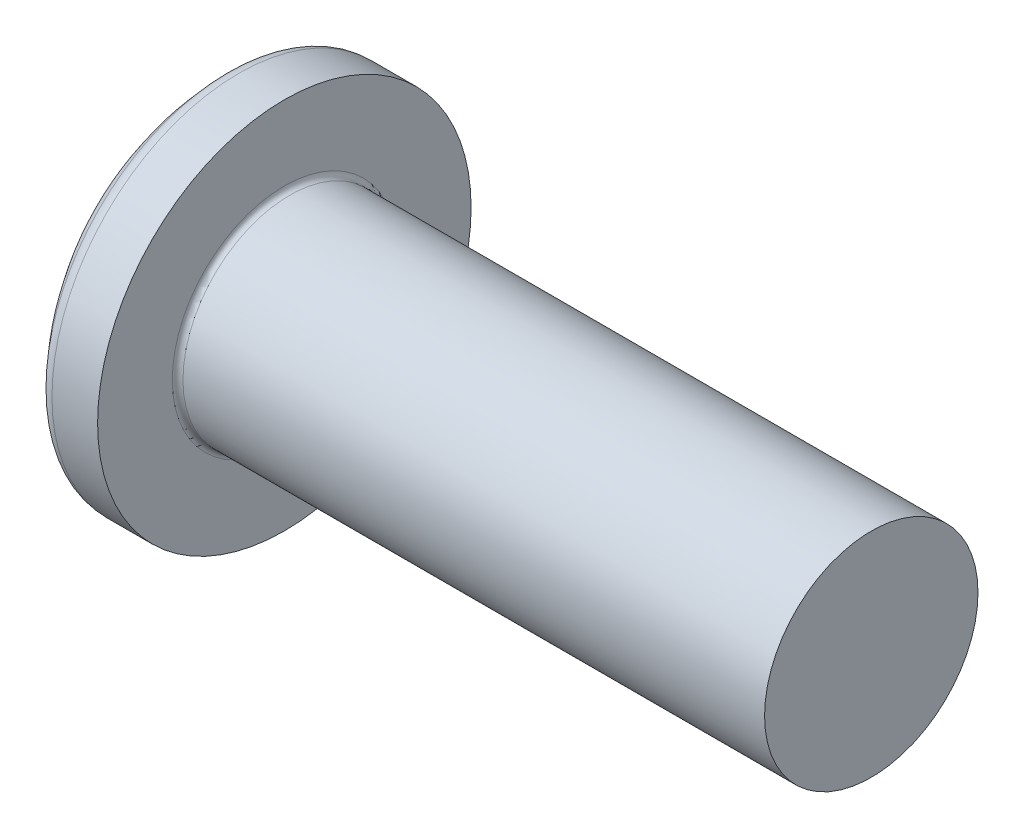
ISO-10303-21;
HEADER;
FILE_DESCRIPTION(('STEP AP214'),'2;1');
FILE_NAME('part.step','',(''),(''),'','','');
FILE_SCHEMA(('AUTOMOTIVE_DESIGN { 1 0 10303 214 1 1 1 1 }'));
ENDSEC;
DATA;
#1=APPLICATION_CONTEXT('core data for automotive mechanical design processes');
#2=APPLICATION_PROTOCOL_DEFINITION('international standard','automotive_design',2000,#1);
#3=PRODUCT_CONTEXT('',#1,'mechanical');
#4=PRODUCT('Part','Part','',(#3));
#5=PRODUCT_RELATED_PRODUCT_CATEGORY('part','',(#4));
#6=PRODUCT_DEFINITION_FORMATION('','',#4);
#7=PRODUCT_DEFINITION_CONTEXT('part definition',#1,'design');
#8=PRODUCT_DEFINITION('design','',#6,#7);
#9=PRODUCT_DEFINITION_SHAPE('','',#8);
#10=(LENGTH_UNIT() NAMED_UNIT(*) SI_UNIT(.MILLI.,.METRE.));
#11=(NAMED_UNIT(*) PLANE_ANGLE_UNIT() SI_UNIT($,.RADIAN.));
#12=(NAMED_UNIT(*) SI_UNIT($,.STERADIAN.) SOLID_ANGLE_UNIT());
#13=UNCERTAINTY_MEASURE_WITH_UNIT(LENGTH_MEASURE(1.E-05),#10,'distance_accuracy_value','');
#14=(GEOMETRIC_REPRESENTATION_CONTEXT(3) GLOBAL_UNCERTAINTY_ASSIGNED_CONTEXT((#13)) GLOBAL_UNIT_ASSIGNED_CONTEXT((#10,
#11,#12)) REPRESENTATION_CONTEXT('',''));
#15=CARTESIAN_POINT('',(0.,0.,0.));
#16=DIRECTION('',(0.,0.,1.));
#17=DIRECTION('',(1.,0.,0.));
#18=AXIS2_PLACEMENT_3D('',#15,#16,#17);
#19=CARTESIAN_POINT('',(5.,0.,0.));
#20=DIRECTION('',(-1.,0.,0.));
#21=DIRECTION('',(0.,1.,0.));
#22=AXIS2_PLACEMENT_3D('',#19,#20,#21);
#23=SPHERICAL_SURFACE('',#22,5.);
#24=CARTESIAN_POINT('',(1.34732504372706,0.,0.));
#25=DIRECTION('',(-1.,0.,0.));
#26=DIRECTION('',(0.,0.,1.));
#27=AXIS2_PLACEMENT_3D('',#24,#25,#26);
#28=CIRCLE('',#27,3.41437632135307);
#29=CARTESIAN_POINT('',(1.34732504372706,0.,3.41437632135307));
#30=VERTEX_POINT('',#29);
#31=EDGE_CURVE('E242',#30,#30,#28,.T.);
#32=ORIENTED_EDGE('',*,*,#31,.T.);
#33=EDGE_LOOP('',(#32));
#34=FACE_BOUND('',#33,.T.);
#35=CARTESIAN_POINT('',(0.04579512008964,0.,0.));
#36=DIRECTION('',(1.,0.,0.));
#37=DIRECTION('',(0.,0.,-1.));
#38=AXIS2_PLACEMENT_3D('',#35,#36,#37);
#39=CIRCLE('',#38,0.675169614150692);
#40=CARTESIAN_POINT('',(0.0457951200896408,-0.369999999999998,-0.564760133040919));
#41=VERTEX_POINT('',#40);
#42=CARTESIAN_POINT('',(0.04579512008964,-0.564760133040918,-0.37));
#43=VERTEX_POINT('',#42);
#44=EDGE_CURVE('E378',#41,#43,#39,.F.);
#45=ORIENTED_EDGE('',*,*,#44,.F.);
#46=CARTESIAN_POINT('',(5.,-0.370000000000001,0.));
#47=DIRECTION('',(0.,1.,0.));
#48=DIRECTION('',(0.,0.,1.));
#49=AXIS2_PLACEMENT_3D('',#46,#47,#48);
#50=CIRCLE('',#49,4.98629120689917);
#51=CARTESIAN_POINT('',(0.187869734228638,-0.369999999999995,-1.30633162146802));
#52=VERTEX_POINT('',#51);
#53=EDGE_CURVE('E304',#52,#41,#50,.T.);
#54=ORIENTED_EDGE('',*,*,#53,.F.);
#55=CARTESIAN_POINT('',(4.56358262530798,0.,0.875317983305918));
#56=DIRECTION('',(0.446197753347436,0.,-0.894934391398443));
#57=DIRECTION('',(-0.894934391398443,0.,-0.446197753347436));
#58=AXIS2_PLACEMENT_3D('',#55,#56,#57);
#59=CIRCLE('',#58,4.90340272700175);
#60=CARTESIAN_POINT('',(0.187869734228638,0.370000000000005,-1.30633162146802));
#61=VERTEX_POINT('',#60);
#62=EDGE_CURVE('E276',#52,#61,#59,.T.);
#63=ORIENTED_EDGE('',*,*,#62,.T.);
#64=CARTESIAN_POINT('',(5.,0.37,0.));
#65=DIRECTION('',(0.,-1.,0.));
#66=DIRECTION('',(0.,0.,-1.));
#67=AXIS2_PLACEMENT_3D('',#64,#65,#66);
#68=CIRCLE('',#67,4.98629120689917);
#69=CARTESIAN_POINT('',(0.0457951200896421,0.370000000000002,-0.564760133040916));
#70=VERTEX_POINT('',#69);
#71=EDGE_CURVE('E331',#70,#61,#68,.T.);
#72=ORIENTED_EDGE('',*,*,#71,.F.);
#73=CARTESIAN_POINT('',(0.04579512008964,0.564760133040913,-0.37));
#74=VERTEX_POINT('',#73);
#75=EDGE_CURVE('E397',#74,#70,#39,.F.);
#76=ORIENTED_EDGE('',*,*,#75,.F.);
#77=CARTESIAN_POINT('',(5.,0.,-0.37));
#78=DIRECTION('',(0.,0.,1.));
#79=DIRECTION('',(1.,0.,0.));
#80=AXIS2_PLACEMENT_3D('',#77,#78,#79);
#81=CIRCLE('',#80,4.98629120689917);
#82=CARTESIAN_POINT('',(0.18786973422864,1.30633162146802,-0.37));
#83=VERTEX_POINT('',#82);
#84=EDGE_CURVE('E270',#83,#74,#81,.T.);
#85=ORIENTED_EDGE('',*,*,#84,.F.);
#86=CARTESIAN_POINT('',(4.56358262530798,-0.87531798330592,0.));
#87=DIRECTION('',(0.446197753347436,0.894934391398443,0.));
#88=DIRECTION('',(-0.894934391398442,0.446197753347436,0.));
#89=AXIS2_PLACEMENT_3D('',#86,#87,#88);
#90=CIRCLE('',#89,4.90340272700175);
#91=CARTESIAN_POINT('',(0.187869734228639,1.30633162146802,0.37));
#92=VERTEX_POINT('',#91);
#93=EDGE_CURVE('E273',#83,#92,#90,.T.);
#94=ORIENTED_EDGE('',*,*,#93,.T.);
#95=CARTESIAN_POINT('',(5.,0.,0.370000000000001));
#96=DIRECTION('',(0.,0.,-1.));
#97=DIRECTION('',(-1.,0.,0.));
#98=AXIS2_PLACEMENT_3D('',#95,#96,#97);
#99=CIRCLE('',#98,4.98629120689917);
#100=CARTESIAN_POINT('',(0.04579512008964,0.564760133040908,0.37));
#101=VERTEX_POINT('',#100);
#102=EDGE_CURVE('E266',#101,#92,#99,.T.);
#103=ORIENTED_EDGE('',*,*,#102,.F.);
#104=CARTESIAN_POINT('',(0.0457951200896426,0.369999999999998,0.564760133040918));
#105=VERTEX_POINT('',#104);
#106=EDGE_CURVE('E396',#105,#101,#39,.F.);
#107=ORIENTED_EDGE('',*,*,#106,.F.);
#108=CARTESIAN_POINT('',(0.18786973422864,0.369999999999995,1.30633162146802));
#109=VERTEX_POINT('',#108);
#110=EDGE_CURVE('E286',#109,#105,#68,.T.);
#111=ORIENTED_EDGE('',*,*,#110,.F.);
#112=CARTESIAN_POINT('',(4.56358262530798,0.,-0.87531798330592));
#113=DIRECTION('',(0.446197753347436,0.,0.894934391398443));
#114=DIRECTION('',(0.894934391398442,0.,-0.446197753347436));
#115=AXIS2_PLACEMENT_3D('',#112,#113,#114);
#116=CIRCLE('',#115,4.90340272700175);
#117=CARTESIAN_POINT('',(0.187869734228638,-0.370000000000004,1.30633162146802));
#118=VERTEX_POINT('',#117);
#119=EDGE_CURVE('E53',#109,#118,#116,.T.);
#120=ORIENTED_EDGE('',*,*,#119,.T.);
#121=CARTESIAN_POINT('',(0.0457951200896404,-0.370000000000002,0.564760133040916));
#122=VERTEX_POINT('',#121);
#123=EDGE_CURVE('E283',#122,#118,#50,.T.);
#124=ORIENTED_EDGE('',*,*,#123,.F.);
#125=CARTESIAN_POINT('',(0.04579512008964,-0.564760133040914,0.37));
#126=VERTEX_POINT('',#125);
#127=EDGE_CURVE('E436',#126,#122,#39,.F.);
#128=ORIENTED_EDGE('',*,*,#127,.F.);
#129=CARTESIAN_POINT('',(0.187869734228638,-1.30633162146802,0.37));
#130=VERTEX_POINT('',#129);
#131=EDGE_CURVE('E267',#130,#126,#99,.T.);
#132=ORIENTED_EDGE('',*,*,#131,.F.);
#133=CARTESIAN_POINT('',(4.56358262530798,0.875317983305918,0.));
#134=DIRECTION('',(0.446197753347436,-0.894934391398443,0.));
#135=DIRECTION('',(0.894934391398443,0.446197753347436,0.));
#136=AXIS2_PLACEMENT_3D('',#133,#134,#135);
#137=CIRCLE('',#136,4.90340272700175);
#138=CARTESIAN_POINT('',(0.187869734228638,-1.30633162146802,-0.37));
#139=VERTEX_POINT('',#138);
#140=EDGE_CURVE('E263',#130,#139,#137,.T.);
#141=ORIENTED_EDGE('',*,*,#140,.T.);
#142=EDGE_CURVE('E68',#43,#139,#81,.T.);
#143=ORIENTED_EDGE('',*,*,#142,.F.);
#144=EDGE_LOOP('',(#45,#54,#63,#72,#76,#85,#94,#103,#107,#111,#120,#124,#128,#132,#141,#143));
#145=FACE_BOUND('',#144,.T.);
#146=ADVANCED_FACE('F39',(#34,#145),#23,.T.);
#147=CARTESIAN_POINT('',(1.75,0.527482331818931,-0.37));
#148=DIRECTION('',(0.,0.,1.));
#149=DIRECTION('',(1.,0.,0.));
#150=AXIS2_PLACEMENT_3D('',#147,#148,#149);
#151=PLANE('',#150);
#152=ORIENTED_EDGE('',*,*,#84,.T.);
#153=CARTESIAN_POINT('',(-0.987293237053717,0.649401255967161,-0.37));
#154=CARTESIAN_POINT('',(-0.781914975317086,0.632865887002871,-0.37));
#155=CARTESIAN_POINT('',(-0.576547882393374,0.616188977635081,-0.37));
#156=CARTESIAN_POINT('',(-0.165841599226328,0.582441031964227,-0.37));
#157=CARTESIAN_POINT('',(0.0394975903090439,0.56536998705488,-0.37));
#158=CARTESIAN_POINT('',(0.450133475422571,0.530723441326535,-0.37));
#159=CARTESIAN_POINT('',(0.655430171010572,0.513147940624557,-0.37));
#160=CARTESIAN_POINT('',(1.06596140177933,0.477314957985794,-0.37));
#161=CARTESIAN_POINT('',(1.2711959378071,0.459057485806066,-0.37));
#162=CARTESIAN_POINT('',(1.61065292365626,0.428051938688769,-0.37));
#163=CARTESIAN_POINT('',(1.74490059995642,0.415580824990931,-0.37));
#164=CARTESIAN_POINT('',(2.01334321762763,0.390092023404979,-0.37));
#165=CARTESIAN_POINT('',(2.14753815934577,0.377074339177353,-0.37));
#166=CARTESIAN_POINT('',(2.41586354151957,0.350315629452843,-0.37));
#167=CARTESIAN_POINT('',(2.5499939784531,0.33657456817765,-0.37));
#168=CARTESIAN_POINT('',(2.81814173295471,0.308004077741875,-0.37));
#169=CARTESIAN_POINT('',(2.95215904765134,0.293174621747065,-0.37));
#170=CARTESIAN_POINT('',(3.0860955068368,0.277618485071816,-0.37));
#171=B_SPLINE_CURVE_WITH_KNOTS('',3,(#153,#154,#155,#156,#157,#158,#159,#160,#161,#162,#163,
#164,#165,#166,#167,#168,#169,#170),.UNSPECIFIED.,.F.,.F.,(4,2,2,2,2,2,2,2,4),(0.,
0.618128793984691,1.23627109812525,1.85441325887562,2.4725465791681,2.87702276218609,
3.28149623678161,3.68598973550942,4.09049321032311),.UNSPECIFIED.);
#172=CARTESIAN_POINT('',(1.75,0.415013252800437,-0.370000000000001));
#173=VERTEX_POINT('',#172);
#174=EDGE_CURVE('E420',#74,#173,#171,.T.);
#175=ORIENTED_EDGE('',*,*,#174,.T.);
#176=DIRECTION('',(0.,1.,0.));
#177=VECTOR('',#176,1.);
#178=CARTESIAN_POINT('',(1.75,-0.527482331818931,-0.37));
#179=LINE('',#178,#177);
#180=CARTESIAN_POINT('',(1.75,0.527482331818931,-0.37));
#181=VERTEX_POINT('',#180);
#182=EDGE_CURVE('E360',#173,#181,#179,.T.);
#183=ORIENTED_EDGE('',*,*,#182,.T.);
#184=DIRECTION('',(0.894934391398442,-0.446197753347436,0.));
#185=VECTOR('',#184,1.);
#186=CARTESIAN_POINT('',(0.,1.4,-0.37));
#187=LINE('',#186,#185);
#188=EDGE_CURVE('E243',#83,#181,#187,.T.);
#189=ORIENTED_EDGE('',*,*,#188,.F.);
#190=EDGE_LOOP('',(#152,#175,#183,#189));
#191=FACE_BOUND('',#190,.T.);
#192=ADVANCED_FACE('F198',(#191),#151,.T.);
#193=CARTESIAN_POINT('',(1.75,-0.527482331818931,-0.37));
#194=VERTEX_POINT('',#193);
#195=CARTESIAN_POINT('',(1.75,-0.415013252800437,-0.370000000000001));
#196=VERTEX_POINT('',#195);
#197=EDGE_CURVE('E251',#194,#196,#179,.T.);
#198=ORIENTED_EDGE('',*,*,#197,.T.);
#199=CARTESIAN_POINT('',(-0.987293237053717,-0.649401255967161,-0.37));
#200=CARTESIAN_POINT('',(-0.781914975317086,-0.632865887002871,-0.37));
#201=CARTESIAN_POINT('',(-0.576547882393374,-0.616188977635081,-0.37));
#202=CARTESIAN_POINT('',(-0.165841599226328,-0.582441031964227,-0.37));
#203=CARTESIAN_POINT('',(0.0394975903090439,-0.56536998705488,-0.37));
#204=CARTESIAN_POINT('',(0.450133475422571,-0.530723441326535,-0.37));
#205=CARTESIAN_POINT('',(0.655430171010572,-0.513147940624557,-0.37));
#206=CARTESIAN_POINT('',(1.06596140177933,-0.477314957985794,-0.37));
#207=CARTESIAN_POINT('',(1.2711959378071,-0.459057485806066,-0.37));
#208=CARTESIAN_POINT('',(1.61065292365626,-0.428051938688769,-0.37));
#209=CARTESIAN_POINT('',(1.74490059995642,-0.415580824990931,-0.37));
#210=CARTESIAN_POINT('',(2.01334321762763,-0.39009202340498,-0.37));
#211=CARTESIAN_POINT('',(2.14753815934577,-0.377074339177353,-0.37));
#212=CARTESIAN_POINT('',(2.41586354151957,-0.350315629452842,-0.37));
#213=CARTESIAN_POINT('',(2.5499939784531,-0.33657456817765,-0.37));
#214=CARTESIAN_POINT('',(2.81814173295471,-0.308004077741875,-0.37));
#215=CARTESIAN_POINT('',(2.95215904765134,-0.293174621747065,-0.37));
#216=CARTESIAN_POINT('',(3.0860955068368,-0.277618485071815,-0.37));
#217=B_SPLINE_CURVE_WITH_KNOTS('',3,(#199,#200,#201,#202,#203,#204,#205,#206,#207,#208,#209,
#210,#211,#212,#213,#214,#215,#216),.UNSPECIFIED.,.F.,.F.,(4,2,2,2,2,2,2,2,4),(0.,
0.618128793984691,1.23627109812525,1.85441325887562,2.4725465791681,2.87702276218609,
3.28149623678161,3.68598973550942,4.09049321032311),.UNSPECIFIED.);
#218=EDGE_CURVE('E395',#196,#43,#217,.F.);
#219=ORIENTED_EDGE('',*,*,#218,.T.);
#220=ORIENTED_EDGE('',*,*,#142,.T.);
#221=DIRECTION('',(0.894934391398443,0.446197753347436,0.));
#222=VECTOR('',#221,1.);
#223=CARTESIAN_POINT('',(0.,-1.4,-0.37));
#224=LINE('',#223,#222);
#225=EDGE_CURVE('E334',#139,#194,#224,.T.);
#226=ORIENTED_EDGE('',*,*,#225,.T.);
#227=EDGE_LOOP('',(#198,#219,#220,#226));
#228=FACE_BOUND('',#227,.T.);
#229=ADVANCED_FACE('F204',(#228),#151,.T.);
#230=CARTESIAN_POINT('',(1.75,-0.527482331818931,0.37));
#231=DIRECTION('',(0.,0.,-1.));
#232=DIRECTION('',(-1.,0.,0.));
#233=AXIS2_PLACEMENT_3D('',#230,#231,#232);
#234=PLANE('',#233);
#235=DIRECTION('',(0.,-1.,0.));
#236=VECTOR('',#235,1.);
#237=CARTESIAN_POINT('',(1.75,0.527482331818931,0.37));
#238=LINE('',#237,#236);
#239=CARTESIAN_POINT('',(1.75,0.527482331818931,0.37));
#240=VERTEX_POINT('',#239);
#241=CARTESIAN_POINT('',(1.75,0.415013252800437,0.37));
#242=VERTEX_POINT('',#241);
#243=EDGE_CURVE('E343',#240,#242,#238,.T.);
#244=ORIENTED_EDGE('',*,*,#243,.T.);
#245=CARTESIAN_POINT('',(-0.987293237069635,0.649401255968442,0.369999999999999));
#246=CARTESIAN_POINT('',(-0.781914975331302,0.632865887004023,0.369999999999999));
#247=CARTESIAN_POINT('',(-0.576547882405888,0.616188977636103,0.369999999999999));
#248=CARTESIAN_POINT('',(-0.16584159923544,0.582441031964983,0.37));
#249=CARTESIAN_POINT('',(0.0394975903016334,0.5653699870555,0.37));
#250=CARTESIAN_POINT('',(0.450133475420601,0.530723441326706,0.37));
#251=CARTESIAN_POINT('',(0.655430171012341,0.513147940624409,0.37));
#252=CARTESIAN_POINT('',(1.06596140178858,0.477314957984981,0.37));
#253=CARTESIAN_POINT('',(1.27119593782008,0.459057485804908,0.37));
#254=CARTESIAN_POINT('',(1.61065292367297,0.428051938687225,0.37));
#255=CARTESIAN_POINT('',(1.74490059997313,0.415580824989367,0.37));
#256=CARTESIAN_POINT('',(2.01334321764434,0.390092023403371,0.37));
#257=CARTESIAN_POINT('',(2.14753815936247,0.377074339175718,0.37));
#258=CARTESIAN_POINT('',(2.41586354153627,0.350315629451146,0.37));
#259=CARTESIAN_POINT('',(2.54999397846979,0.336574568175918,0.37));
#260=CARTESIAN_POINT('',(2.8181417329714,0.308004077740053,0.37));
#261=CARTESIAN_POINT('',(2.95215904766802,0.293174621745189,0.37));
#262=CARTESIAN_POINT('',(3.08609550685347,0.277618485069873,0.37));
#263=B_SPLINE_CURVE_WITH_KNOTS('',3,(#245,#246,#247,#248,#249,#250,#251,#252,#253,#254,#255,
#256,#257,#258,#259,#260,#261,#262),.UNSPECIFIED.,.F.,.F.,(4,2,2,2,2,2,2,2,4),(0.,
0.618128793989811,1.23627109813549,1.85441325889711,2.47254657920086,2.87702276221884,
3.28149623681437,3.68598973554218,4.09049321035586),.UNSPECIFIED.);
#264=EDGE_CURVE('E675',#242,#101,#263,.F.);
#265=ORIENTED_EDGE('',*,*,#264,.T.);
#266=ORIENTED_EDGE('',*,*,#102,.T.);
#267=DIRECTION('',(0.894934391398442,-0.446197753347436,0.));
#268=VECTOR('',#267,1.);
#269=CARTESIAN_POINT('',(0.,1.4,0.37));
#270=LINE('',#269,#268);
#271=EDGE_CURVE('E248',#92,#240,#270,.T.);
#272=ORIENTED_EDGE('',*,*,#271,.T.);
#273=EDGE_LOOP('',(#244,#265,#266,#272));
#274=FACE_BOUND('',#273,.T.);
#275=ADVANCED_FACE('F416',(#274),#234,.T.);
#276=ORIENTED_EDGE('',*,*,#131,.T.);
#277=CARTESIAN_POINT('',(-0.987293237069635,-0.649401255968442,0.369999999999999));
#278=CARTESIAN_POINT('',(-0.781914975331302,-0.632865887004024,0.369999999999999));
#279=CARTESIAN_POINT('',(-0.576547882405889,-0.616188977636103,0.369999999999999));
#280=CARTESIAN_POINT('',(-0.16584159923544,-0.582441031964983,0.369999999999999));
#281=CARTESIAN_POINT('',(0.039497590301633,-0.5653699870555,0.37));
#282=CARTESIAN_POINT('',(0.450133475420601,-0.530723441326706,0.37));
#283=CARTESIAN_POINT('',(0.65543017101234,-0.513147940624409,0.37));
#284=CARTESIAN_POINT('',(1.06596140178858,-0.477314957984981,0.37));
#285=CARTESIAN_POINT('',(1.27119593782008,-0.459057485804908,0.37));
#286=CARTESIAN_POINT('',(1.61065292367297,-0.428051938687225,0.37));
#287=CARTESIAN_POINT('',(1.74490059997313,-0.415580824989367,0.37));
#288=CARTESIAN_POINT('',(2.01334321764434,-0.390092023403371,0.37));
#289=CARTESIAN_POINT('',(2.14753815936247,-0.377074339175718,0.37));
#290=CARTESIAN_POINT('',(2.41586354153627,-0.350315629451146,0.37));
#291=CARTESIAN_POINT('',(2.54999397846979,-0.336574568175918,0.37));
#292=CARTESIAN_POINT('',(2.8181417329714,-0.308004077740054,0.37));
#293=CARTESIAN_POINT('',(2.95215904766802,-0.293174621745189,0.37));
#294=CARTESIAN_POINT('',(3.08609550685347,-0.277618485069873,0.37));
#295=B_SPLINE_CURVE_WITH_KNOTS('',3,(#277,#278,#279,#280,#281,#282,#283,#284,#285,#286,#287,
#288,#289,#290,#291,#292,#293,#294),.UNSPECIFIED.,.F.,.F.,(4,2,2,2,2,2,2,2,4),(0.,
0.61812879398981,1.23627109813549,1.85441325889711,2.47254657920086,2.87702276221884,
3.28149623681436,3.68598973554217,4.09049321035586),.UNSPECIFIED.);
#296=CARTESIAN_POINT('',(1.75,-0.415013252800437,0.37));
#297=VERTEX_POINT('',#296);
#298=EDGE_CURVE('E437',#126,#297,#295,.T.);
#299=ORIENTED_EDGE('',*,*,#298,.T.);
#300=CARTESIAN_POINT('',(1.75,-0.527482331818932,0.37));
#301=VERTEX_POINT('',#300);
#302=EDGE_CURVE('E345',#297,#301,#238,.T.);
#303=ORIENTED_EDGE('',*,*,#302,.T.);
#304=DIRECTION('',(0.894934391398443,0.446197753347436,0.));
#305=VECTOR('',#304,1.);
#306=CARTESIAN_POINT('',(0.,-1.4,0.369999999999999));
#307=LINE('',#306,#305);
#308=EDGE_CURVE('E336',#130,#301,#307,.T.);
#309=ORIENTED_EDGE('',*,*,#308,.F.);
#310=EDGE_LOOP('',(#276,#299,#303,#309));
#311=FACE_BOUND('',#310,.T.);
#312=ADVANCED_FACE('F523',(#311),#234,.T.);
#313=CARTESIAN_POINT('',(0.,1.4,0.37));
#314=DIRECTION('',(0.446197753347436,0.894934391398443,0.));
#315=DIRECTION('',(-0.894934391398442,0.446197753347436,0.));
#316=AXIS2_PLACEMENT_3D('',#313,#314,#315);
#317=PLANE('',#316);
#318=CARTESIAN_POINT('',(2.6696526882832,0.0689604923233248,0.));
#319=DIRECTION('',(0.446197753347436,0.894934391398443,0.));
#320=DIRECTION('',(-0.894934391398443,0.446197753347436,0.));
#321=AXIS2_PLACEMENT_3D('',#318,#319,#320);
#322=ELLIPSE('',#321,1.10195897609154,0.486831694838766);
#323=CARTESIAN_POINT('',(1.75,0.527482331818932,0.175779377683682));
#324=VERTEX_POINT('',#323);
#325=CARTESIAN_POINT('',(1.75,0.527482331818932,-0.175779377683682));
#326=VERTEX_POINT('',#325);
#327=EDGE_CURVE('E309',#324,#326,#322,.F.);
#328=ORIENTED_EDGE('',*,*,#327,.F.);
#329=DIRECTION('',(0.,0.,-1.));
#330=VECTOR('',#329,1.);
#331=CARTESIAN_POINT('',(1.75,0.527482331818931,0.37));
#332=LINE('',#331,#330);
#333=EDGE_CURVE('E346',#240,#324,#332,.T.);
#334=ORIENTED_EDGE('',*,*,#333,.F.);
#335=ORIENTED_EDGE('',*,*,#271,.F.);
#336=ORIENTED_EDGE('',*,*,#93,.F.);
#337=ORIENTED_EDGE('',*,*,#188,.T.);
#338=EDGE_CURVE('E348',#326,#181,#332,.T.);
#339=ORIENTED_EDGE('',*,*,#338,.F.);
#340=EDGE_LOOP('',(#328,#334,#335,#336,#337,#339));
#341=FACE_BOUND('',#340,.T.);
#342=ADVANCED_FACE('F414',(#341),#317,.F.);
#343=CARTESIAN_POINT('',(0.,-1.4,-0.37));
#344=DIRECTION('',(0.446197753347436,-0.894934391398443,0.));
#345=DIRECTION('',(0.894934391398443,0.446197753347436,0.));
#346=AXIS2_PLACEMENT_3D('',#343,#344,#345);
#347=PLANE('',#346);
#348=CARTESIAN_POINT('',(2.6696526882832,-0.0689604923233254,0.));
#349=DIRECTION('',(0.446197753347436,-0.894934391398443,0.));
#350=DIRECTION('',(-0.894934391398443,-0.446197753347436,0.));
#351=AXIS2_PLACEMENT_3D('',#348,#349,#350);
#352=ELLIPSE('',#351,1.10195897609154,0.486831694838766);
#353=CARTESIAN_POINT('',(1.75,-0.527482331818932,-0.175779377683681));
#354=VERTEX_POINT('',#353);
#355=CARTESIAN_POINT('',(1.75,-0.527482331818932,0.175779377683681));
#356=VERTEX_POINT('',#355);
#357=EDGE_CURVE('E677',#354,#356,#352,.F.);
#358=ORIENTED_EDGE('',*,*,#357,.F.);
#359=DIRECTION('',(0.,0.,1.));
#360=VECTOR('',#359,1.);
#361=CARTESIAN_POINT('',(1.75,-0.527482331818931,-0.37));
#362=LINE('',#361,#360);
#363=EDGE_CURVE('E339',#194,#354,#362,.T.);
#364=ORIENTED_EDGE('',*,*,#363,.F.);
#365=ORIENTED_EDGE('',*,*,#225,.F.);
#366=ORIENTED_EDGE('',*,*,#140,.F.);
#367=ORIENTED_EDGE('',*,*,#308,.T.);
#368=EDGE_CURVE('E342',#356,#301,#362,.T.);
#369=ORIENTED_EDGE('',*,*,#368,.F.);
#370=EDGE_LOOP('',(#358,#364,#365,#366,#367,#369));
#371=FACE_BOUND('',#370,.T.);
#372=ADVANCED_FACE('F510',(#371),#347,.F.);
#373=CARTESIAN_POINT('',(1.75,0.527482331818931,-0.37));
#374=DIRECTION('',(-1.,0.,0.));
#375=DIRECTION('',(0.,0.,1.));
#376=AXIS2_PLACEMENT_3D('',#373,#374,#375);
#377=PLANE('',#376);
#378=DIRECTION('',(0.,1.,0.));
#379=VECTOR('',#378,1.);
#380=CARTESIAN_POINT('',(1.75,-0.370000000000002,0.52748233181893));
#381=LINE('',#380,#379);
#382=CARTESIAN_POINT('',(1.75,-0.370000000000002,0.52748233181893));
#383=VERTEX_POINT('',#382);
#384=CARTESIAN_POINT('',(1.75,-0.175779377683685,0.527482331818931));
#385=VERTEX_POINT('',#384);
#386=EDGE_CURVE('E324',#383,#385,#381,.T.);
#387=ORIENTED_EDGE('',*,*,#386,.T.);
#388=CARTESIAN_POINT('',(1.75,0.,0.));
#389=DIRECTION('',(-1.,0.,0.));
#390=DIRECTION('',(0.,0.,1.));
#391=AXIS2_PLACEMENT_3D('',#388,#389,#390);
#392=CIRCLE('',#391,0.556);
#393=CARTESIAN_POINT('',(1.75,-0.370000000000001,0.415013252800436));
#394=VERTEX_POINT('',#393);
#395=EDGE_CURVE('E705',#394,#385,#392,.T.);
#396=ORIENTED_EDGE('',*,*,#395,.F.);
#397=DIRECTION('',(0.,0.,-1.));
#398=VECTOR('',#397,1.);
#399=CARTESIAN_POINT('',(1.75,-0.370000000000002,0.52748233181893));
#400=LINE('',#399,#398);
#401=EDGE_CURVE('E320',#383,#394,#400,.T.);
#402=ORIENTED_EDGE('',*,*,#401,.F.);
#403=EDGE_LOOP('',(#387,#396,#402));
#404=FACE_BOUND('',#403,.T.);
#405=ADVANCED_FACE('F503',(#404),#377,.T.);
#406=ORIENTED_EDGE('',*,*,#302,.F.);
#407=EDGE_CURVE('E710',#356,#297,#392,.T.);
#408=ORIENTED_EDGE('',*,*,#407,.F.);
#409=ORIENTED_EDGE('',*,*,#368,.T.);
#410=EDGE_LOOP('',(#406,#408,#409));
#411=FACE_BOUND('',#410,.T.);
#412=ADVANCED_FACE('F496',(#411),#377,.T.);
#413=ORIENTED_EDGE('',*,*,#363,.T.);
#414=EDGE_CURVE('E389',#196,#354,#392,.T.);
#415=ORIENTED_EDGE('',*,*,#414,.F.);
#416=ORIENTED_EDGE('',*,*,#197,.F.);
#417=EDGE_LOOP('',(#413,#415,#416));
#418=FACE_BOUND('',#417,.T.);
#419=ADVANCED_FACE('F490',(#418),#377,.T.);
#420=CARTESIAN_POINT('',(1.75,-0.369999999999998,-0.415013252800438));
#421=VERTEX_POINT('',#420);
#422=CARTESIAN_POINT('',(1.75,-0.369999999999998,-0.527482331818933));
#423=VERTEX_POINT('',#422);
#424=EDGE_CURVE('E323',#421,#423,#400,.T.);
#425=ORIENTED_EDGE('',*,*,#424,.F.);
#426=CARTESIAN_POINT('',(1.75,-0.17577937768368,-0.527482331818932));
#427=VERTEX_POINT('',#426);
#428=EDGE_CURVE('E60',#427,#421,#392,.T.);
#429=ORIENTED_EDGE('',*,*,#428,.F.);
#430=DIRECTION('',(0.,-1.,0.));
#431=VECTOR('',#430,1.);
#432=CARTESIAN_POINT('',(1.75,0.370000000000002,-0.52748233181893));
#433=LINE('',#432,#431);
#434=EDGE_CURVE('E319',#427,#423,#433,.T.);
#435=ORIENTED_EDGE('',*,*,#434,.T.);
#436=EDGE_LOOP('',(#425,#429,#435));
#437=FACE_BOUND('',#436,.T.);
#438=ADVANCED_FACE('F384',(#437),#377,.T.);
#439=CARTESIAN_POINT('',(1.75,0.370000000000002,-0.52748233181893));
#440=VERTEX_POINT('',#439);
#441=CARTESIAN_POINT('',(1.75,0.175779377683684,-0.527482331818931));
#442=VERTEX_POINT('',#441);
#443=EDGE_CURVE('E316',#440,#442,#433,.T.);
#444=ORIENTED_EDGE('',*,*,#443,.T.);
#445=CARTESIAN_POINT('',(1.75,0.370000000000001,-0.415013252800437));
#446=VERTEX_POINT('',#445);
#447=EDGE_CURVE('E388',#446,#442,#392,.T.);
#448=ORIENTED_EDGE('',*,*,#447,.F.);
#449=DIRECTION('',(0.,0.,1.));
#450=VECTOR('',#449,1.);
#451=CARTESIAN_POINT('',(1.75,0.370000000000002,-0.52748233181893));
#452=LINE('',#451,#450);
#453=EDGE_CURVE('E328',#440,#446,#452,.T.);
#454=ORIENTED_EDGE('',*,*,#453,.F.);
#455=EDGE_LOOP('',(#444,#448,#454));
#456=FACE_BOUND('',#455,.T.);
#457=ADVANCED_FACE('F478',(#456),#377,.T.);
#458=ORIENTED_EDGE('',*,*,#182,.F.);
#459=EDGE_CURVE('E694',#326,#173,#392,.T.);
#460=ORIENTED_EDGE('',*,*,#459,.F.);
#461=ORIENTED_EDGE('',*,*,#338,.T.);
#462=EDGE_LOOP('',(#458,#460,#461));
#463=FACE_BOUND('',#462,.T.);
#464=ADVANCED_FACE('F471',(#463),#377,.T.);
#465=ORIENTED_EDGE('',*,*,#333,.T.);
#466=EDGE_CURVE('E696',#242,#324,#392,.T.);
#467=ORIENTED_EDGE('',*,*,#466,.F.);
#468=ORIENTED_EDGE('',*,*,#243,.F.);
#469=EDGE_LOOP('',(#465,#467,#468));
#470=FACE_BOUND('',#469,.T.);
#471=ADVANCED_FACE('F465',(#470),#377,.T.);
#472=CARTESIAN_POINT('',(1.75,0.369999999999998,0.527482331818932));
#473=DIRECTION('',(0.,-1.,0.));
#474=DIRECTION('',(1.,0.,0.));
#475=AXIS2_PLACEMENT_3D('',#472,#473,#474);
#476=PLANE('',#475);
#477=ORIENTED_EDGE('',*,*,#110,.T.);
#478=CARTESIAN_POINT('',(-0.987293237053717,0.369999999999998,0.649401255967162));
#479=CARTESIAN_POINT('',(-0.781914975317085,0.369999999999998,0.632865887002872));
#480=CARTESIAN_POINT('',(-0.576547882393373,0.369999999999998,0.616188977635082));
#481=CARTESIAN_POINT('',(-0.165841599226327,0.369999999999998,0.582441031964228));
#482=CARTESIAN_POINT('',(0.0394975903090446,0.369999999999998,0.565369987054881));
#483=CARTESIAN_POINT('',(0.450133475422572,0.369999999999998,0.530723441326536));
#484=CARTESIAN_POINT('',(0.655430171010573,0.369999999999998,0.513147940624558));
#485=CARTESIAN_POINT('',(1.06596140177934,0.369999999999998,0.477314957985795));
#486=CARTESIAN_POINT('',(1.2711959378071,0.369999999999998,0.459057485806067));
#487=CARTESIAN_POINT('',(1.61065292365626,0.369999999999999,0.42805193868877));
#488=CARTESIAN_POINT('',(1.74490059995642,0.369999999999999,0.415580824990932));
#489=CARTESIAN_POINT('',(2.01334321762763,0.369999999999999,0.390092023404981));
#490=CARTESIAN_POINT('',(2.14753815934577,0.369999999999999,0.377074339177354));
#491=CARTESIAN_POINT('',(2.41586354151957,0.369999999999999,0.350315629452844));
#492=CARTESIAN_POINT('',(2.5499939784531,0.369999999999999,0.336574568177651));
#493=CARTESIAN_POINT('',(2.81814173295471,0.369999999999999,0.308004077741876));
#494=CARTESIAN_POINT('',(2.95215904765134,0.369999999999999,0.293174621747066));
#495=CARTESIAN_POINT('',(3.0860955068368,0.369999999999999,0.277618485071817));
#496=B_SPLINE_CURVE_WITH_KNOTS('',3,(#478,#479,#480,#481,#482,#483,#484,#485,#486,#487,#488,
#489,#490,#491,#492,#493,#494,#495),.UNSPECIFIED.,.F.,.F.,(4,2,2,2,2,2,2,2,4),(0.,
0.618128793984691,1.23627109812525,1.85441325887562,2.4725465791681,2.87702276218609,
3.28149623678161,3.68598973550942,4.09049321032311),.UNSPECIFIED.);
#497=CARTESIAN_POINT('',(1.75,0.369999999999999,0.415013252800439));
#498=VERTEX_POINT('',#497);
#499=EDGE_CURVE('E674',#105,#498,#496,.T.);
#500=ORIENTED_EDGE('',*,*,#499,.T.);
#501=CARTESIAN_POINT('',(1.75,0.369999999999998,0.527482331818932));
#502=VERTEX_POINT('',#501);
#503=EDGE_CURVE('E301',#498,#502,#452,.T.);
#504=ORIENTED_EDGE('',*,*,#503,.T.);
#505=DIRECTION('',(0.894934391398442,0.,-0.446197753347436));
#506=VECTOR('',#505,1.);
#507=CARTESIAN_POINT('',(0.,0.369999999999995,1.4));
#508=LINE('',#507,#506);
#509=EDGE_CURVE('E294',#109,#502,#508,.T.);
#510=ORIENTED_EDGE('',*,*,#509,.F.);
#511=EDGE_LOOP('',(#477,#500,#504,#510));
#512=FACE_BOUND('',#511,.T.);
#513=ADVANCED_FACE('F298',(#512),#476,.T.);
#514=CARTESIAN_POINT('',(1.75,-0.369999999999998,-0.527482331818933));
#515=DIRECTION('',(0.,1.,0.));
#516=DIRECTION('',(-1.,0.,0.));
#517=AXIS2_PLACEMENT_3D('',#514,#515,#516);
#518=PLANE('',#517);
#519=ORIENTED_EDGE('',*,*,#401,.T.);
#520=CARTESIAN_POINT('',(-0.987293237069635,-0.370000000000002,0.649401255968441));
#521=CARTESIAN_POINT('',(-0.781914975331302,-0.370000000000002,0.632865887004022));
#522=CARTESIAN_POINT('',(-0.576547882405889,-0.370000000000002,0.616188977636101));
#523=CARTESIAN_POINT('',(-0.16584159923544,-0.370000000000002,0.582441031964982));
#524=CARTESIAN_POINT('',(0.0394975903016332,-0.370000000000002,0.565369987055499));
#525=CARTESIAN_POINT('',(0.450133475420601,-0.370000000000002,0.530723441326705));
#526=CARTESIAN_POINT('',(0.65543017101234,-0.370000000000002,0.513147940624408));
#527=CARTESIAN_POINT('',(1.06596140178858,-0.370000000000001,0.47731495798498));
#528=CARTESIAN_POINT('',(1.27119593782008,-0.370000000000001,0.459057485804906));
#529=CARTESIAN_POINT('',(1.61065292367297,-0.370000000000001,0.428051938687223));
#530=CARTESIAN_POINT('',(1.74490059997313,-0.370000000000001,0.415580824989366));
#531=CARTESIAN_POINT('',(2.01334321764434,-0.370000000000001,0.390092023403369));
#532=CARTESIAN_POINT('',(2.14753815936247,-0.370000000000001,0.377074339175717));
#533=CARTESIAN_POINT('',(2.41586354153627,-0.370000000000001,0.350315629451145));
#534=CARTESIAN_POINT('',(2.54999397846979,-0.370000000000001,0.336574568175917));
#535=CARTESIAN_POINT('',(2.8181417329714,-0.370000000000001,0.308004077740052));
#536=CARTESIAN_POINT('',(2.95215904766802,-0.370000000000001,0.293174621745188));
#537=CARTESIAN_POINT('',(3.08609550685347,-0.370000000000001,0.277618485069872));
#538=B_SPLINE_CURVE_WITH_KNOTS('',3,(#520,#521,#522,#523,#524,#525,#526,#527,#528,#529,#530,
#531,#532,#533,#534,#535,#536,#537),.UNSPECIFIED.,.F.,.F.,(4,2,2,2,2,2,2,2,4),(0.,
0.618128793989811,1.23627109813549,1.85441325889711,2.47254657920086,2.87702276221884,
3.28149623681437,3.68598973554218,4.09049321035586),.UNSPECIFIED.);
#539=EDGE_CURVE('E429',#394,#122,#538,.F.);
#540=ORIENTED_EDGE('',*,*,#539,.T.);
#541=ORIENTED_EDGE('',*,*,#123,.T.);
#542=DIRECTION('',(0.894934391398442,0.,-0.446197753347436));
#543=VECTOR('',#542,1.);
#544=CARTESIAN_POINT('',(0.,-0.370000000000005,1.4));
#545=LINE('',#544,#543);
#546=EDGE_CURVE('E296',#118,#383,#545,.T.);
#547=ORIENTED_EDGE('',*,*,#546,.T.);
#548=EDGE_LOOP('',(#519,#540,#541,#547));
#549=FACE_BOUND('',#548,.T.);
#550=ADVANCED_FACE('F233',(#549),#518,.T.);
#551=CARTESIAN_POINT('',(0.,-0.370000000000005,1.4));
#552=DIRECTION('',(0.446197753347436,0.,0.894934391398443));
#553=DIRECTION('',(-0.894934391398442,0.,0.446197753347436));
#554=AXIS2_PLACEMENT_3D('',#551,#552,#553);
#555=PLANE('',#554);
#556=CARTESIAN_POINT('',(2.6696526882832,0.,0.0689604923233248));
#557=DIRECTION('',(0.446197753347436,0.,0.894934391398443));
#558=DIRECTION('',(-0.894934391398443,0.,0.446197753347436));
#559=AXIS2_PLACEMENT_3D('',#556,#557,#558);
#560=ELLIPSE('',#559,1.10195897609154,0.486831694838766);
#561=CARTESIAN_POINT('',(1.75,0.175779377683682,0.527482331818932));
#562=VERTEX_POINT('',#561);
#563=EDGE_CURVE('E427',#385,#562,#560,.F.);
#564=ORIENTED_EDGE('',*,*,#563,.F.);
#565=ORIENTED_EDGE('',*,*,#386,.F.);
#566=ORIENTED_EDGE('',*,*,#546,.F.);
#567=ORIENTED_EDGE('',*,*,#119,.F.);
#568=ORIENTED_EDGE('',*,*,#509,.T.);
#569=EDGE_CURVE('E327',#562,#502,#381,.T.);
#570=ORIENTED_EDGE('',*,*,#569,.F.);
#571=EDGE_LOOP('',(#564,#565,#566,#567,#568,#570));
#572=FACE_BOUND('',#571,.T.);
#573=ADVANCED_FACE('F292',(#572),#555,.F.);
#574=CARTESIAN_POINT('',(0.,0.370000000000005,-1.4));
#575=DIRECTION('',(0.446197753347436,0.,-0.894934391398443));
#576=DIRECTION('',(0.894934391398443,0.,0.446197753347436));
#577=AXIS2_PLACEMENT_3D('',#574,#575,#576);
#578=PLANE('',#577);
#579=CARTESIAN_POINT('',(2.6696526882832,0.,-0.0689604923233255));
#580=DIRECTION('',(0.446197753347436,0.,-0.894934391398443));
#581=DIRECTION('',(-0.894934391398443,0.,-0.446197753347436));
#582=AXIS2_PLACEMENT_3D('',#579,#580,#581);
#583=ELLIPSE('',#582,1.10195897609154,0.486831694838766);
#584=EDGE_CURVE('E382',#442,#427,#583,.F.);
#585=ORIENTED_EDGE('',*,*,#584,.F.);
#586=ORIENTED_EDGE('',*,*,#443,.F.);
#587=DIRECTION('',(0.894934391398443,0.,0.446197753347436));
#588=VECTOR('',#587,1.);
#589=CARTESIAN_POINT('',(0.,0.370000000000005,-1.4));
#590=LINE('',#589,#588);
#591=EDGE_CURVE('E306',#61,#440,#590,.T.);
#592=ORIENTED_EDGE('',*,*,#591,.F.);
#593=ORIENTED_EDGE('',*,*,#62,.F.);
#594=DIRECTION('',(0.894934391398443,0.,0.446197753347436));
#595=VECTOR('',#594,1.);
#596=CARTESIAN_POINT('',(0.,-0.369999999999995,-1.4));
#597=LINE('',#596,#595);
#598=EDGE_CURVE('E313',#52,#423,#597,.T.);
#599=ORIENTED_EDGE('',*,*,#598,.T.);
#600=ORIENTED_EDGE('',*,*,#434,.F.);
#601=EDGE_LOOP('',(#585,#586,#592,#593,#599,#600));
#602=FACE_BOUND('',#601,.T.);
#603=ADVANCED_FACE('F373',(#602),#578,.F.);
#604=ORIENTED_EDGE('',*,*,#453,.T.);
#605=CARTESIAN_POINT('',(-0.987293237069636,0.370000000000002,-0.649401255968441));
#606=CARTESIAN_POINT('',(-0.781914975331303,0.370000000000002,-0.632865887004022));
#607=CARTESIAN_POINT('',(-0.57654788240589,0.370000000000002,-0.616188977636101));
#608=CARTESIAN_POINT('',(-0.165841599235441,0.370000000000002,-0.582441031964982));
#609=CARTESIAN_POINT('',(0.0394975903016319,0.370000000000002,-0.565369987055499));
#610=CARTESIAN_POINT('',(0.450133475420599,0.370000000000002,-0.530723441326705));
#611=CARTESIAN_POINT('',(0.655430171012339,0.370000000000002,-0.513147940624408));
#612=CARTESIAN_POINT('',(1.06596140178858,0.370000000000002,-0.47731495798498));
#613=CARTESIAN_POINT('',(1.27119593782008,0.370000000000002,-0.459057485804907));
#614=CARTESIAN_POINT('',(1.61065292367296,0.370000000000001,-0.428051938687224));
#615=CARTESIAN_POINT('',(1.74490059997313,0.370000000000001,-0.415580824989366));
#616=CARTESIAN_POINT('',(2.01334321764433,0.370000000000001,-0.390092023403369));
#617=CARTESIAN_POINT('',(2.14753815936247,0.370000000000001,-0.377074339175717));
#618=CARTESIAN_POINT('',(2.41586354153627,0.370000000000001,-0.350315629451145));
#619=CARTESIAN_POINT('',(2.54999397846979,0.370000000000001,-0.336574568175917));
#620=CARTESIAN_POINT('',(2.8181417329714,0.370000000000001,-0.308004077740052));
#621=CARTESIAN_POINT('',(2.95215904766802,0.370000000000001,-0.293174621745188));
#622=CARTESIAN_POINT('',(3.08609550685347,0.370000000000001,-0.277618485069872));
#623=B_SPLINE_CURVE_WITH_KNOTS('',3,(#605,#606,#607,#608,#609,#610,#611,#612,#613,#614,#615,
#616,#617,#618,#619,#620,#621,#622),.UNSPECIFIED.,.F.,.F.,(4,2,2,2,2,2,2,2,4),(0.,
0.61812879398981,1.23627109813549,1.85441325889711,2.47254657920086,2.87702276221884,
3.28149623681436,3.68598973554218,4.09049321035586),.UNSPECIFIED.);
#624=EDGE_CURVE('E369',#446,#70,#623,.F.);
#625=ORIENTED_EDGE('',*,*,#624,.T.);
#626=ORIENTED_EDGE('',*,*,#71,.T.);
#627=ORIENTED_EDGE('',*,*,#591,.T.);
#628=EDGE_LOOP('',(#604,#625,#626,#627));
#629=FACE_BOUND('',#628,.T.);
#630=ADVANCED_FACE('F231',(#629),#476,.T.);
#631=ORIENTED_EDGE('',*,*,#53,.T.);
#632=CARTESIAN_POINT('',(-0.987293237053717,-0.369999999999997,-0.649401255967162));
#633=CARTESIAN_POINT('',(-0.781914975317086,-0.369999999999997,-0.632865887002873));
#634=CARTESIAN_POINT('',(-0.576547882393374,-0.369999999999997,-0.616188977635082));
#635=CARTESIAN_POINT('',(-0.165841599226328,-0.369999999999997,-0.582441031964228));
#636=CARTESIAN_POINT('',(0.0394975903090439,-0.369999999999998,-0.565369987054881));
#637=CARTESIAN_POINT('',(0.450133475422571,-0.369999999999998,-0.530723441326536));
#638=CARTESIAN_POINT('',(0.655430171010572,-0.369999999999998,-0.513147940624558));
#639=CARTESIAN_POINT('',(1.06596140177934,-0.369999999999998,-0.477314957985795));
#640=CARTESIAN_POINT('',(1.2711959378071,-0.369999999999998,-0.459057485806068));
#641=CARTESIAN_POINT('',(1.61065292365626,-0.369999999999998,-0.42805193868877));
#642=CARTESIAN_POINT('',(1.74490059995642,-0.369999999999998,-0.415580824990932));
#643=CARTESIAN_POINT('',(2.01334321762763,-0.369999999999999,-0.390092023404981));
#644=CARTESIAN_POINT('',(2.14753815934577,-0.369999999999999,-0.377074339177355));
#645=CARTESIAN_POINT('',(2.41586354151957,-0.369999999999999,-0.350315629452844));
#646=CARTESIAN_POINT('',(2.54999397845309,-0.369999999999999,-0.336574568177652));
#647=CARTESIAN_POINT('',(2.81814173295471,-0.369999999999999,-0.308004077741876));
#648=CARTESIAN_POINT('',(2.95215904765134,-0.369999999999999,-0.293174621747066));
#649=CARTESIAN_POINT('',(3.0860955068368,-0.369999999999999,-0.277618485071817));
#650=B_SPLINE_CURVE_WITH_KNOTS('',3,(#632,#633,#634,#635,#636,#637,#638,#639,#640,#641,#642,
#643,#644,#645,#646,#647,#648,#649),.UNSPECIFIED.,.F.,.F.,(4,2,2,2,2,2,2,2,4),(0.,
0.618128793984691,1.23627109812525,1.85441325887562,2.4725465791681,2.87702276218609,
3.28149623678161,3.68598973550942,4.09049321032311),.UNSPECIFIED.);
#651=EDGE_CURVE('E11',#41,#421,#650,.T.);
#652=ORIENTED_EDGE('',*,*,#651,.T.);
#653=ORIENTED_EDGE('',*,*,#424,.T.);
#654=ORIENTED_EDGE('',*,*,#598,.F.);
#655=EDGE_LOOP('',(#631,#652,#653,#654));
#656=FACE_BOUND('',#655,.T.);
#657=ADVANCED_FACE('F226',(#656),#518,.T.);
#658=CARTESIAN_POINT('',(-25.4,0.,0.));
#659=DIRECTION('',(-1.,0.,0.));
#660=DIRECTION('',(0.,0.,1.));
#661=AXIS2_PLACEMENT_3D('',#658,#659,#660);
#662=CYLINDRICAL_SURFACE('',#661,2.);
#663=CARTESIAN_POINT('',(2.5,0.,0.));
#664=DIRECTION('',(-1.,0.,0.));
#665=DIRECTION('',(0.,0.,1.));
#666=AXIS2_PLACEMENT_3D('',#663,#664,#665);
#667=CIRCLE('',#666,2.);
#668=CARTESIAN_POINT('',(2.5,0.,2.));
#669=VERTEX_POINT('',#668);
#670=EDGE_CURVE('E237',#669,#669,#667,.F.);
#671=ORIENTED_EDGE('',*,*,#670,.T.);
#672=EDGE_LOOP('',(#671));
#673=FACE_BOUND('',#672,.T.);
#674=CARTESIAN_POINT('',(13.4,0.,0.));
#675=DIRECTION('',(-1.,0.,0.));
#676=DIRECTION('',(0.,0.,1.));
#677=AXIS2_PLACEMENT_3D('',#674,#675,#676);
#678=CIRCLE('',#677,2.);
#679=CARTESIAN_POINT('',(13.4,0.,2.));
#680=VERTEX_POINT('',#679);
#681=EDGE_CURVE('E240',#680,#680,#678,.T.);
#682=ORIENTED_EDGE('',*,*,#681,.T.);
#683=EDGE_LOOP('',(#682));
#684=FACE_BOUND('',#683,.T.);
#685=ADVANCED_FACE('F223',(#673,#684),#662,.T.);
#686=CARTESIAN_POINT('',(2.4,2.,0.));
#687=DIRECTION('',(-1.,0.,0.));
#688=DIRECTION('',(0.,0.,1.));
#689=AXIS2_PLACEMENT_3D('',#686,#687,#688);
#690=PLANE('',#689);
#691=CARTESIAN_POINT('',(2.4,0.,0.));
#692=DIRECTION('',(-1.,0.,0.));
#693=DIRECTION('',(0.,0.,1.));
#694=AXIS2_PLACEMENT_3D('',#691,#692,#693);
#695=CIRCLE('',#694,2.1);
#696=CARTESIAN_POINT('',(2.4,0.,2.1));
#697=VERTEX_POINT('',#696);
#698=EDGE_CURVE('E259',#697,#697,#695,.T.);
#699=ORIENTED_EDGE('',*,*,#698,.T.);
#700=EDGE_LOOP('',(#699));
#701=FACE_BOUND('',#700,.T.);
#702=CARTESIAN_POINT('',(2.4,0.,0.));
#703=DIRECTION('',(-1.,0.,0.));
#704=DIRECTION('',(0.,0.,1.));
#705=AXIS2_PLACEMENT_3D('',#702,#703,#704);
#706=CIRCLE('',#705,3.5);
#707=CARTESIAN_POINT('',(2.4,0.,3.5));
#708=VERTEX_POINT('',#707);
#709=EDGE_CURVE('E256',#708,#708,#706,.T.);
#710=ORIENTED_EDGE('',*,*,#709,.F.);
#711=EDGE_LOOP('',(#710));
#712=FACE_BOUND('',#711,.T.);
#713=ADVANCED_FACE('F220',(#701,#712),#690,.F.);
#714=CARTESIAN_POINT('',(-25.4,0.,0.));
#715=DIRECTION('',(-1.,0.,0.));
#716=DIRECTION('',(0.,0.,1.));
#717=AXIS2_PLACEMENT_3D('',#714,#715,#716);
#718=CYLINDRICAL_SURFACE('',#717,3.5);
#719=ORIENTED_EDGE('',*,*,#709,.T.);
#720=EDGE_LOOP('',(#719));
#721=FACE_BOUND('',#720,.T.);
#722=CARTESIAN_POINT('',(1.5445694913658,0.,0.));
#723=DIRECTION('',(-1.,0.,0.));
#724=DIRECTION('',(0.,0.,1.));
#725=AXIS2_PLACEMENT_3D('',#722,#723,#724);
#726=CIRCLE('',#725,3.5);
#727=CARTESIAN_POINT('',(1.5445694913658,0.,3.5));
#728=VERTEX_POINT('',#727);
#729=EDGE_CURVE('E245',#728,#728,#726,.T.);
#730=ORIENTED_EDGE('',*,*,#729,.F.);
#731=EDGE_LOOP('',(#730));
#732=FACE_BOUND('',#731,.T.);
#733=ADVANCED_FACE('F216',(#721,#732),#718,.T.);
#734=CARTESIAN_POINT('',(1.5445694913658,0.,0.));
#735=DIRECTION('',(-1.,0.,0.));
#736=DIRECTION('',(0.,0.,1.));
#737=AXIS2_PLACEMENT_3D('',#734,#735,#736);
#738=TOROIDAL_SURFACE('',#737,3.23,0.27);
#739=ORIENTED_EDGE('',*,*,#729,.T.);
#740=EDGE_LOOP('',(#739));
#741=FACE_BOUND('',#740,.T.);
#742=ORIENTED_EDGE('',*,*,#31,.F.);
#743=EDGE_LOOP('',(#742));
#744=FACE_BOUND('',#743,.T.);
#745=ADVANCED_FACE('F213',(#741,#744),#738,.T.);
#746=CARTESIAN_POINT('',(13.4,2.,0.));
#747=DIRECTION('',(1.,0.,0.));
#748=DIRECTION('',(0.,0.,-1.));
#749=AXIS2_PLACEMENT_3D('',#746,#747,#748);
#750=PLANE('',#749);
#751=ORIENTED_EDGE('',*,*,#681,.F.);
#752=EDGE_LOOP('',(#751));
#753=FACE_BOUND('',#752,.T.);
#754=ADVANCED_FACE('F211',(#753),#750,.T.);
#755=CARTESIAN_POINT('',(2.5,0.,0.));
#756=DIRECTION('',(-1.,0.,0.));
#757=DIRECTION('',(0.,0.,1.));
#758=AXIS2_PLACEMENT_3D('',#755,#756,#757);
#759=TOROIDAL_SURFACE('',#758,2.1,0.1);
#760=ORIENTED_EDGE('',*,*,#670,.F.);
#761=EDGE_LOOP('',(#760));
#762=FACE_BOUND('',#761,.T.);
#763=ORIENTED_EDGE('',*,*,#698,.F.);
#764=EDGE_LOOP('',(#763));
#765=FACE_BOUND('',#764,.T.);
#766=ADVANCED_FACE('F41',(#762,#765),#759,.F.);
#767=ORIENTED_EDGE('',*,*,#503,.F.);
#768=EDGE_CURVE('E390',#562,#498,#392,.T.);
#769=ORIENTED_EDGE('',*,*,#768,.F.);
#770=ORIENTED_EDGE('',*,*,#569,.T.);
#771=EDGE_LOOP('',(#767,#769,#770));
#772=FACE_BOUND('',#771,.T.);
#773=ADVANCED_FACE('F472',(#772),#377,.T.);
#774=CARTESIAN_POINT('',(1.75,0.,0.));
#775=DIRECTION('',(-1.,0.,0.));
#776=DIRECTION('',(0.,0.,1.));
#777=AXIS2_PLACEMENT_3D('',#774,#775,#776);
#778=CONICAL_SURFACE('',#777,0.556,0.0698131700797659);
#779=ORIENTED_EDGE('',*,*,#327,.T.);
#780=EDGE_CURVE('E691',#324,#326,#392,.T.);
#781=ORIENTED_EDGE('',*,*,#780,.F.);
#782=EDGE_LOOP('',(#779,#781));
#783=FACE_BOUND('',#782,.T.);
#784=ADVANCED_FACE('F195',(#783),#778,.F.);
#785=ORIENTED_EDGE('',*,*,#357,.T.);
#786=EDGE_CURVE('E711',#354,#356,#392,.T.);
#787=ORIENTED_EDGE('',*,*,#786,.F.);
#788=EDGE_LOOP('',(#785,#787));
#789=FACE_BOUND('',#788,.T.);
#790=ADVANCED_FACE('F605',(#789),#778,.F.);
#791=EDGE_CURVE('E392',#498,#242,#392,.T.);
#792=ORIENTED_EDGE('',*,*,#791,.F.);
#793=ORIENTED_EDGE('',*,*,#499,.F.);
#794=ORIENTED_EDGE('',*,*,#106,.T.);
#795=ORIENTED_EDGE('',*,*,#264,.F.);
#796=EDGE_LOOP('',(#792,#793,#794,#795));
#797=FACE_BOUND('',#796,.T.);
#798=ADVANCED_FACE('F611',(#797),#778,.F.);
#799=ORIENTED_EDGE('',*,*,#563,.T.);
#800=EDGE_CURVE('E393',#385,#562,#392,.T.);
#801=ORIENTED_EDGE('',*,*,#800,.F.);
#802=EDGE_LOOP('',(#799,#801));
#803=FACE_BOUND('',#802,.T.);
#804=ADVANCED_FACE('F618',(#803),#778,.F.);
#805=ORIENTED_EDGE('',*,*,#584,.T.);
#806=EDGE_CURVE('E385',#442,#427,#392,.T.);
#807=ORIENTED_EDGE('',*,*,#806,.F.);
#808=EDGE_LOOP('',(#805,#807));
#809=FACE_BOUND('',#808,.T.);
#810=ADVANCED_FACE('F625',(#809),#778,.F.);
#811=ORIENTED_EDGE('',*,*,#127,.T.);
#812=ORIENTED_EDGE('',*,*,#539,.F.);
#813=EDGE_CURVE('E707',#297,#394,#392,.T.);
#814=ORIENTED_EDGE('',*,*,#813,.F.);
#815=ORIENTED_EDGE('',*,*,#298,.F.);
#816=EDGE_LOOP('',(#811,#812,#814,#815));
#817=FACE_BOUND('',#816,.T.);
#818=ADVANCED_FACE('F632',(#817),#778,.F.);
#819=ORIENTED_EDGE('',*,*,#75,.T.);
#820=ORIENTED_EDGE('',*,*,#624,.F.);
#821=EDGE_CURVE('E697',#173,#446,#392,.T.);
#822=ORIENTED_EDGE('',*,*,#821,.F.);
#823=ORIENTED_EDGE('',*,*,#174,.F.);
#824=EDGE_LOOP('',(#819,#820,#822,#823));
#825=FACE_BOUND('',#824,.T.);
#826=ADVANCED_FACE('F193',(#825),#778,.F.);
#827=EDGE_CURVE('E386',#421,#196,#392,.T.);
#828=ORIENTED_EDGE('',*,*,#827,.F.);
#829=ORIENTED_EDGE('',*,*,#651,.F.);
#830=ORIENTED_EDGE('',*,*,#44,.T.);
#831=ORIENTED_EDGE('',*,*,#218,.F.);
#832=EDGE_LOOP('',(#828,#829,#830,#831));
#833=FACE_BOUND('',#832,.T.);
#834=ADVANCED_FACE('F188',(#833),#778,.F.);
#835=CARTESIAN_POINT('',(1.93065535110549,0.,0.));
#836=DIRECTION('',(-1.,0.,0.));
#837=DIRECTION('',(0.,0.,1.));
#838=AXIS2_PLACEMENT_3D('',#835,#836,#837);
#839=CONICAL_SURFACE('',#838,0.,1.25663706143592);
#840=ORIENTED_EDGE('',*,*,#768,.T.);
#841=ORIENTED_EDGE('',*,*,#791,.T.);
#842=ORIENTED_EDGE('',*,*,#466,.T.);
#843=ORIENTED_EDGE('',*,*,#780,.T.);
#844=ORIENTED_EDGE('',*,*,#459,.T.);
#845=ORIENTED_EDGE('',*,*,#821,.T.);
#846=ORIENTED_EDGE('',*,*,#447,.T.);
#847=ORIENTED_EDGE('',*,*,#806,.T.);
#848=ORIENTED_EDGE('',*,*,#428,.T.);
#849=ORIENTED_EDGE('',*,*,#827,.T.);
#850=ORIENTED_EDGE('',*,*,#414,.T.);
#851=ORIENTED_EDGE('',*,*,#786,.T.);
#852=ORIENTED_EDGE('',*,*,#407,.T.);
#853=ORIENTED_EDGE('',*,*,#813,.T.);
#854=ORIENTED_EDGE('',*,*,#395,.T.);
#855=ORIENTED_EDGE('',*,*,#800,.T.);
#856=EDGE_LOOP('',(#840,#841,#842,#843,#844,#845,#846,#847,#848,#849,#850,#851,#852,#853,#854,#855));
#857=FACE_BOUND('',#856,.T.);
#858=CARTESIAN_POINT('',(1.93065535110549,0.,0.));
#859=VERTEX_POINT('',#858);
#860=VERTEX_LOOP('',#859);
#861=FACE_BOUND('',#860,.T.);
#862=ADVANCED_FACE('F186',(#857,#861),#839,.F.);
#863=CLOSED_SHELL('',(#146,#192,#229,#275,#312,#342,#372,#405,#412,#419,#438,#457,#464,#471,
#513,#550,#573,#603,#630,#657,#685,#713,#733,#745,#754,#766,#773,#784,#790,#798,#804,#810,#818,
#826,#834,#862));
#864=MANIFOLD_SOLID_BREP('B2',#863);
#865=ADVANCED_BREP_SHAPE_REPRESENTATION('',(#18,#864),#14);
#866=SHAPE_DEFINITION_REPRESENTATION(#9,#865);
ENDSEC;
END-ISO-10303-21;
